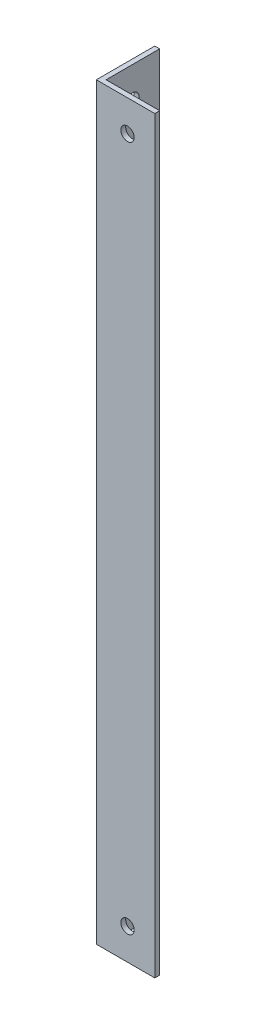
ISO-10303-21;
HEADER;
FILE_DESCRIPTION(('STEP AP214'),'2;1');
FILE_NAME('part.step','',(''),(''),'','','');
FILE_SCHEMA(('AUTOMOTIVE_DESIGN { 1 0 10303 214 1 1 1 1 }'));
ENDSEC;
DATA;
#1=APPLICATION_CONTEXT('core data for automotive mechanical design processes');
#2=APPLICATION_PROTOCOL_DEFINITION('international standard','automotive_design',2000,#1);
#3=PRODUCT_CONTEXT('',#1,'mechanical');
#4=PRODUCT('Part','Part','',(#3));
#5=PRODUCT_RELATED_PRODUCT_CATEGORY('part','',(#4));
#6=PRODUCT_DEFINITION_FORMATION('','',#4);
#7=PRODUCT_DEFINITION_CONTEXT('part definition',#1,'design');
#8=PRODUCT_DEFINITION('design','',#6,#7);
#9=PRODUCT_DEFINITION_SHAPE('','',#8);
#10=(LENGTH_UNIT() NAMED_UNIT(*) SI_UNIT(.MILLI.,.METRE.));
#11=(NAMED_UNIT(*) PLANE_ANGLE_UNIT() SI_UNIT($,.RADIAN.));
#12=(NAMED_UNIT(*) SI_UNIT($,.STERADIAN.) SOLID_ANGLE_UNIT());
#13=UNCERTAINTY_MEASURE_WITH_UNIT(LENGTH_MEASURE(1.E-05),#10,'distance_accuracy_value','');
#14=(GEOMETRIC_REPRESENTATION_CONTEXT(3) GLOBAL_UNCERTAINTY_ASSIGNED_CONTEXT((#13)) GLOBAL_UNIT_ASSIGNED_CONTEXT((#10,
#11,#12)) REPRESENTATION_CONTEXT('',''));
#15=CARTESIAN_POINT('',(0.,0.,0.));
#16=DIRECTION('',(0.,0.,1.));
#17=DIRECTION('',(1.,0.,0.));
#18=AXIS2_PLACEMENT_3D('',#15,#16,#17);
#19=CARTESIAN_POINT('',(0.,243.84,0.));
#20=DIRECTION('',(0.,0.,-1.));
#21=DIRECTION('',(-1.,0.,0.));
#22=AXIS2_PLACEMENT_3D('',#19,#20,#21);
#23=PLANE('',#22);
#24=CARTESIAN_POINT('',(10.16,10.16,0.));
#25=DIRECTION('',(0.,0.,1.));
#26=DIRECTION('',(1.,0.,0.));
#27=AXIS2_PLACEMENT_3D('',#24,#25,#26);
#28=CIRCLE('',#27,2.1828125);
#29=CARTESIAN_POINT('',(12.3428125,10.16,0.));
#30=VERTEX_POINT('',#29);
#31=EDGE_CURVE('E155',#30,#30,#28,.T.);
#32=ORIENTED_EDGE('',*,*,#31,.F.);
#33=EDGE_LOOP('',(#32));
#34=FACE_BOUND('',#33,.T.);
#35=CARTESIAN_POINT('',(10.16,233.68,0.));
#36=DIRECTION('',(0.,0.,1.));
#37=DIRECTION('',(1.,0.,0.));
#38=AXIS2_PLACEMENT_3D('',#35,#36,#37);
#39=CIRCLE('',#38,2.1828125);
#40=CARTESIAN_POINT('',(12.3428125,233.68,0.));
#41=VERTEX_POINT('',#40);
#42=EDGE_CURVE('E147',#41,#41,#39,.T.);
#43=ORIENTED_EDGE('',*,*,#42,.F.);
#44=EDGE_LOOP('',(#43));
#45=FACE_BOUND('',#44,.T.);
#46=DIRECTION('',(1.,0.,0.));
#47=VECTOR('',#46,1.);
#48=CARTESIAN_POINT('',(0.,0.,0.));
#49=LINE('',#48,#47);
#50=CARTESIAN_POINT('',(0.,0.,0.));
#51=VERTEX_POINT('',#50);
#52=CARTESIAN_POINT('',(19.05,0.,0.));
#53=VERTEX_POINT('',#52);
#54=EDGE_CURVE('E130',#51,#53,#49,.T.);
#55=ORIENTED_EDGE('',*,*,#54,.T.);
#56=DIRECTION('',(0.,-1.,0.));
#57=VECTOR('',#56,1.);
#58=CARTESIAN_POINT('',(19.05,243.84,0.));
#59=LINE('',#58,#57);
#60=CARTESIAN_POINT('',(19.05,243.84,0.));
#61=VERTEX_POINT('',#60);
#62=EDGE_CURVE('E13',#61,#53,#59,.T.);
#63=ORIENTED_EDGE('',*,*,#62,.F.);
#64=DIRECTION('',(1.,0.,0.));
#65=VECTOR('',#64,1.);
#66=CARTESIAN_POINT('',(0.,243.84,0.));
#67=LINE('',#66,#65);
#68=CARTESIAN_POINT('',(0.,243.84,0.));
#69=VERTEX_POINT('',#68);
#70=EDGE_CURVE('E141',#69,#61,#67,.T.);
#71=ORIENTED_EDGE('',*,*,#70,.F.);
#72=DIRECTION('',(0.,-1.,0.));
#73=VECTOR('',#72,1.);
#74=CARTESIAN_POINT('',(0.,243.84,0.));
#75=LINE('',#74,#73);
#76=EDGE_CURVE('E126',#69,#51,#75,.T.);
#77=ORIENTED_EDGE('',*,*,#76,.T.);
#78=EDGE_LOOP('',(#55,#63,#71,#77));
#79=FACE_BOUND('',#78,.T.);
#80=ADVANCED_FACE('F44',(#34,#45,#79),#23,.F.);
#81=CARTESIAN_POINT('',(19.05,243.84,0.));
#82=DIRECTION('',(-1.,0.,0.));
#83=DIRECTION('',(0.,0.,1.));
#84=AXIS2_PLACEMENT_3D('',#81,#82,#83);
#85=PLANE('',#84);
#86=DIRECTION('',(0.,0.,-1.));
#87=VECTOR('',#86,1.);
#88=CARTESIAN_POINT('',(19.05,0.,0.));
#89=LINE('',#88,#87);
#90=CARTESIAN_POINT('',(19.05,0.,-1.5875));
#91=VERTEX_POINT('',#90);
#92=EDGE_CURVE('E133',#53,#91,#89,.T.);
#93=ORIENTED_EDGE('',*,*,#92,.T.);
#94=DIRECTION('',(0.,-1.,0.));
#95=VECTOR('',#94,1.);
#96=CARTESIAN_POINT('',(19.05,243.84,-1.5875));
#97=LINE('',#96,#95);
#98=CARTESIAN_POINT('',(19.05,243.84,-1.5875));
#99=VERTEX_POINT('',#98);
#100=EDGE_CURVE('E53',#99,#91,#97,.T.);
#101=ORIENTED_EDGE('',*,*,#100,.F.);
#102=DIRECTION('',(0.,0.,-1.));
#103=VECTOR('',#102,1.);
#104=CARTESIAN_POINT('',(19.05,243.84,0.));
#105=LINE('',#104,#103);
#106=EDGE_CURVE('E99',#61,#99,#105,.T.);
#107=ORIENTED_EDGE('',*,*,#106,.F.);
#108=ORIENTED_EDGE('',*,*,#62,.T.);
#109=EDGE_LOOP('',(#93,#101,#107,#108));
#110=FACE_BOUND('',#109,.T.);
#111=ADVANCED_FACE('F162',(#110),#85,.F.);
#112=CARTESIAN_POINT('',(19.05,243.84,-1.5875));
#113=DIRECTION('',(0.,0.,1.));
#114=DIRECTION('',(1.,0.,0.));
#115=AXIS2_PLACEMENT_3D('',#112,#113,#114);
#116=PLANE('',#115);
#117=CARTESIAN_POINT('',(10.16,10.16,-1.5875));
#118=DIRECTION('',(0.,0.,1.));
#119=DIRECTION('',(1.,0.,0.));
#120=AXIS2_PLACEMENT_3D('',#117,#118,#119);
#121=CIRCLE('',#120,2.1828125);
#122=CARTESIAN_POINT('',(12.3428125,10.16,-1.5875));
#123=VERTEX_POINT('',#122);
#124=EDGE_CURVE('E47',#123,#123,#121,.T.);
#125=ORIENTED_EDGE('',*,*,#124,.T.);
#126=EDGE_LOOP('',(#125));
#127=FACE_BOUND('',#126,.T.);
#128=CARTESIAN_POINT('',(10.16,233.68,-1.5875));
#129=DIRECTION('',(0.,0.,1.));
#130=DIRECTION('',(1.,0.,0.));
#131=AXIS2_PLACEMENT_3D('',#128,#129,#130);
#132=CIRCLE('',#131,2.1828125);
#133=CARTESIAN_POINT('',(12.3428125,233.68,-1.5875));
#134=VERTEX_POINT('',#133);
#135=EDGE_CURVE('E134',#134,#134,#132,.T.);
#136=ORIENTED_EDGE('',*,*,#135,.T.);
#137=EDGE_LOOP('',(#136));
#138=FACE_BOUND('',#137,.T.);
#139=DIRECTION('',(-1.,0.,0.));
#140=VECTOR('',#139,1.);
#141=CARTESIAN_POINT('',(19.05,0.,-1.5875));
#142=LINE('',#141,#140);
#143=CARTESIAN_POINT('',(1.5875,0.,-1.5875));
#144=VERTEX_POINT('',#143);
#145=EDGE_CURVE('E136',#91,#144,#142,.T.);
#146=ORIENTED_EDGE('',*,*,#145,.T.);
#147=DIRECTION('',(0.,-1.,0.));
#148=VECTOR('',#147,1.);
#149=CARTESIAN_POINT('',(1.5875,243.84,-1.5875));
#150=LINE('',#149,#148);
#151=CARTESIAN_POINT('',(1.5875,243.84,-1.5875));
#152=VERTEX_POINT('',#151);
#153=EDGE_CURVE('E121',#152,#144,#150,.T.);
#154=ORIENTED_EDGE('',*,*,#153,.F.);
#155=DIRECTION('',(-1.,0.,0.));
#156=VECTOR('',#155,1.);
#157=CARTESIAN_POINT('',(19.05,243.84,-1.5875));
#158=LINE('',#157,#156);
#159=EDGE_CURVE('E112',#99,#152,#158,.T.);
#160=ORIENTED_EDGE('',*,*,#159,.F.);
#161=ORIENTED_EDGE('',*,*,#100,.T.);
#162=EDGE_LOOP('',(#146,#154,#160,#161));
#163=FACE_BOUND('',#162,.T.);
#164=ADVANCED_FACE('F165',(#127,#138,#163),#116,.F.);
#165=CARTESIAN_POINT('',(1.5875,243.84,-1.5875));
#166=DIRECTION('',(-1.,0.,0.));
#167=DIRECTION('',(0.,0.,1.));
#168=AXIS2_PLACEMENT_3D('',#165,#166,#167);
#169=PLANE('',#168);
#170=CARTESIAN_POINT('',(1.5875,10.16,-10.16));
#171=DIRECTION('',(1.,0.,0.));
#172=DIRECTION('',(0.,0.,-1.));
#173=AXIS2_PLACEMENT_3D('',#170,#171,#172);
#174=CIRCLE('',#173,2.1828125);
#175=CARTESIAN_POINT('',(1.5875,10.16,-12.3428125));
#176=VERTEX_POINT('',#175);
#177=EDGE_CURVE('E200',#176,#176,#174,.T.);
#178=ORIENTED_EDGE('',*,*,#177,.F.);
#179=EDGE_LOOP('',(#178));
#180=FACE_BOUND('',#179,.T.);
#181=CARTESIAN_POINT('',(1.5875,233.68,-10.16));
#182=DIRECTION('',(1.,0.,0.));
#183=DIRECTION('',(0.,0.,-1.));
#184=AXIS2_PLACEMENT_3D('',#181,#182,#183);
#185=CIRCLE('',#184,2.1828125);
#186=CARTESIAN_POINT('',(1.5875,233.68,-12.3428125));
#187=VERTEX_POINT('',#186);
#188=EDGE_CURVE('E194',#187,#187,#185,.T.);
#189=ORIENTED_EDGE('',*,*,#188,.F.);
#190=EDGE_LOOP('',(#189));
#191=FACE_BOUND('',#190,.T.);
#192=DIRECTION('',(0.,0.,-1.));
#193=VECTOR('',#192,1.);
#194=CARTESIAN_POINT('',(1.5875,0.,-1.5875));
#195=LINE('',#194,#193);
#196=CARTESIAN_POINT('',(1.5875,0.,-19.05));
#197=VERTEX_POINT('',#196);
#198=EDGE_CURVE('E120',#144,#197,#195,.T.);
#199=ORIENTED_EDGE('',*,*,#198,.T.);
#200=DIRECTION('',(0.,-1.,0.));
#201=VECTOR('',#200,1.);
#202=CARTESIAN_POINT('',(1.5875,243.84,-19.05));
#203=LINE('',#202,#201);
#204=CARTESIAN_POINT('',(1.5875,243.84,-19.05));
#205=VERTEX_POINT('',#204);
#206=EDGE_CURVE('E117',#205,#197,#203,.T.);
#207=ORIENTED_EDGE('',*,*,#206,.F.);
#208=DIRECTION('',(0.,0.,-1.));
#209=VECTOR('',#208,1.);
#210=CARTESIAN_POINT('',(1.5875,243.84,-1.5875));
#211=LINE('',#210,#209);
#212=EDGE_CURVE('E106',#152,#205,#211,.T.);
#213=ORIENTED_EDGE('',*,*,#212,.F.);
#214=ORIENTED_EDGE('',*,*,#153,.T.);
#215=EDGE_LOOP('',(#199,#207,#213,#214));
#216=FACE_BOUND('',#215,.T.);
#217=ADVANCED_FACE('F118',(#180,#191,#216),#169,.F.);
#218=CARTESIAN_POINT('',(1.5875,243.84,-19.05));
#219=DIRECTION('',(0.,0.,1.));
#220=DIRECTION('',(1.,0.,0.));
#221=AXIS2_PLACEMENT_3D('',#218,#219,#220);
#222=PLANE('',#221);
#223=DIRECTION('',(-1.,0.,0.));
#224=VECTOR('',#223,1.);
#225=CARTESIAN_POINT('',(1.5875,0.,-19.05));
#226=LINE('',#225,#224);
#227=CARTESIAN_POINT('',(0.,0.,-19.05));
#228=VERTEX_POINT('',#227);
#229=EDGE_CURVE('E85',#197,#228,#226,.T.);
#230=ORIENTED_EDGE('',*,*,#229,.T.);
#231=DIRECTION('',(0.,-1.,0.));
#232=VECTOR('',#231,1.);
#233=CARTESIAN_POINT('',(0.,243.84,-19.05));
#234=LINE('',#233,#232);
#235=CARTESIAN_POINT('',(0.,243.84,-19.05));
#236=VERTEX_POINT('',#235);
#237=EDGE_CURVE('E122',#236,#228,#234,.T.);
#238=ORIENTED_EDGE('',*,*,#237,.F.);
#239=DIRECTION('',(-1.,0.,0.));
#240=VECTOR('',#239,1.);
#241=CARTESIAN_POINT('',(1.5875,243.84,-19.05));
#242=LINE('',#241,#240);
#243=EDGE_CURVE('E110',#205,#236,#242,.T.);
#244=ORIENTED_EDGE('',*,*,#243,.F.);
#245=ORIENTED_EDGE('',*,*,#206,.T.);
#246=EDGE_LOOP('',(#230,#238,#244,#245));
#247=FACE_BOUND('',#246,.T.);
#248=ADVANCED_FACE('F124',(#247),#222,.F.);
#249=CARTESIAN_POINT('',(0.,243.84,0.));
#250=DIRECTION('',(1.,0.,0.));
#251=DIRECTION('',(0.,0.,-1.));
#252=AXIS2_PLACEMENT_3D('',#249,#250,#251);
#253=PLANE('',#252);
#254=CARTESIAN_POINT('',(0.,10.16,-10.16));
#255=DIRECTION('',(1.,0.,0.));
#256=DIRECTION('',(0.,0.,-1.));
#257=AXIS2_PLACEMENT_3D('',#254,#255,#256);
#258=CIRCLE('',#257,2.1828125);
#259=CARTESIAN_POINT('',(0.,10.16,-12.3428125));
#260=VERTEX_POINT('',#259);
#261=EDGE_CURVE('E198',#260,#260,#258,.T.);
#262=ORIENTED_EDGE('',*,*,#261,.T.);
#263=EDGE_LOOP('',(#262));
#264=FACE_BOUND('',#263,.T.);
#265=CARTESIAN_POINT('',(0.,233.68,-10.16));
#266=DIRECTION('',(1.,0.,0.));
#267=DIRECTION('',(0.,0.,-1.));
#268=AXIS2_PLACEMENT_3D('',#265,#266,#267);
#269=CIRCLE('',#268,2.1828125);
#270=CARTESIAN_POINT('',(0.,233.68,-12.3428125));
#271=VERTEX_POINT('',#270);
#272=EDGE_CURVE('E192',#271,#271,#269,.T.);
#273=ORIENTED_EDGE('',*,*,#272,.T.);
#274=EDGE_LOOP('',(#273));
#275=FACE_BOUND('',#274,.T.);
#276=DIRECTION('',(0.,0.,1.));
#277=VECTOR('',#276,1.);
#278=CARTESIAN_POINT('',(0.,0.,0.));
#279=LINE('',#278,#277);
#280=EDGE_CURVE('E91',#228,#51,#279,.T.);
#281=ORIENTED_EDGE('',*,*,#280,.T.);
#282=ORIENTED_EDGE('',*,*,#76,.F.);
#283=DIRECTION('',(0.,0.,1.));
#284=VECTOR('',#283,1.);
#285=CARTESIAN_POINT('',(0.,243.84,0.));
#286=LINE('',#285,#284);
#287=EDGE_CURVE('E62',#236,#69,#286,.T.);
#288=ORIENTED_EDGE('',*,*,#287,.F.);
#289=ORIENTED_EDGE('',*,*,#237,.T.);
#290=EDGE_LOOP('',(#281,#282,#288,#289));
#291=FACE_BOUND('',#290,.T.);
#292=ADVANCED_FACE('F170',(#264,#275,#291),#253,.F.);
#293=CARTESIAN_POINT('',(0.,243.84,0.));
#294=DIRECTION('',(0.,1.,0.));
#295=DIRECTION('',(0.,0.,1.));
#296=AXIS2_PLACEMENT_3D('',#293,#294,#295);
#297=PLANE('',#296);
#298=ORIENTED_EDGE('',*,*,#70,.T.);
#299=ORIENTED_EDGE('',*,*,#106,.T.);
#300=ORIENTED_EDGE('',*,*,#159,.T.);
#301=ORIENTED_EDGE('',*,*,#212,.T.);
#302=ORIENTED_EDGE('',*,*,#243,.T.);
#303=ORIENTED_EDGE('',*,*,#287,.T.);
#304=EDGE_LOOP('',(#298,#299,#300,#301,#302,#303));
#305=FACE_BOUND('',#304,.T.);
#306=ADVANCED_FACE('F108',(#305),#297,.T.);
#307=CARTESIAN_POINT('',(0.,0.,0.));
#308=DIRECTION('',(0.,1.,0.));
#309=DIRECTION('',(0.,0.,1.));
#310=AXIS2_PLACEMENT_3D('',#307,#308,#309);
#311=PLANE('',#310);
#312=ORIENTED_EDGE('',*,*,#54,.F.);
#313=ORIENTED_EDGE('',*,*,#280,.F.);
#314=ORIENTED_EDGE('',*,*,#229,.F.);
#315=ORIENTED_EDGE('',*,*,#198,.F.);
#316=ORIENTED_EDGE('',*,*,#145,.F.);
#317=ORIENTED_EDGE('',*,*,#92,.F.);
#318=EDGE_LOOP('',(#312,#313,#314,#315,#316,#317));
#319=FACE_BOUND('',#318,.T.);
#320=ADVANCED_FACE('F168',(#319),#311,.F.);
#321=CARTESIAN_POINT('',(10.16,233.68,-2.54));
#322=DIRECTION('',(0.,0.,1.));
#323=DIRECTION('',(1.,0.,0.));
#324=AXIS2_PLACEMENT_3D('',#321,#322,#323);
#325=CYLINDRICAL_SURFACE('',#324,2.1828125);
#326=ORIENTED_EDGE('',*,*,#42,.T.);
#327=EDGE_LOOP('',(#326));
#328=FACE_BOUND('',#327,.T.);
#329=ORIENTED_EDGE('',*,*,#135,.F.);
#330=EDGE_LOOP('',(#329));
#331=FACE_BOUND('',#330,.T.);
#332=ADVANCED_FACE('F224',(#328,#331),#325,.F.);
#333=CARTESIAN_POINT('',(10.16,10.16,-2.54));
#334=DIRECTION('',(0.,0.,1.));
#335=DIRECTION('',(1.,0.,0.));
#336=AXIS2_PLACEMENT_3D('',#333,#334,#335);
#337=CYLINDRICAL_SURFACE('',#336,2.1828125);
#338=ORIENTED_EDGE('',*,*,#31,.T.);
#339=EDGE_LOOP('',(#338));
#340=FACE_BOUND('',#339,.T.);
#341=ORIENTED_EDGE('',*,*,#124,.F.);
#342=EDGE_LOOP('',(#341));
#343=FACE_BOUND('',#342,.T.);
#344=ADVANCED_FACE('F218',(#340,#343),#337,.F.);
#345=CARTESIAN_POINT('',(0.,233.68,-10.16));
#346=DIRECTION('',(1.,0.,0.));
#347=DIRECTION('',(0.,0.,-1.));
#348=AXIS2_PLACEMENT_3D('',#345,#346,#347);
#349=CYLINDRICAL_SURFACE('',#348,2.1828125);
#350=ORIENTED_EDGE('',*,*,#272,.F.);
#351=EDGE_LOOP('',(#350));
#352=FACE_BOUND('',#351,.T.);
#353=ORIENTED_EDGE('',*,*,#188,.T.);
#354=EDGE_LOOP('',(#353));
#355=FACE_BOUND('',#354,.T.);
#356=ADVANCED_FACE('F208',(#352,#355),#349,.F.);
#357=CARTESIAN_POINT('',(0.,10.16,-10.16));
#358=DIRECTION('',(1.,0.,0.));
#359=DIRECTION('',(0.,0.,-1.));
#360=AXIS2_PLACEMENT_3D('',#357,#358,#359);
#361=CYLINDRICAL_SURFACE('',#360,2.1828125);
#362=ORIENTED_EDGE('',*,*,#261,.F.);
#363=EDGE_LOOP('',(#362));
#364=FACE_BOUND('',#363,.T.);
#365=ORIENTED_EDGE('',*,*,#177,.T.);
#366=EDGE_LOOP('',(#365));
#367=FACE_BOUND('',#366,.T.);
#368=ADVANCED_FACE('F205',(#364,#367),#361,.F.);
#369=CLOSED_SHELL('',(#80,#111,#164,#217,#248,#292,#306,#320,#332,#344,#356,#368));
#370=MANIFOLD_SOLID_BREP('B2',#369);
#371=ADVANCED_BREP_SHAPE_REPRESENTATION('',(#18,#370),#14);
#372=SHAPE_DEFINITION_REPRESENTATION(#9,#371);
ENDSEC;
END-ISO-10303-21;
